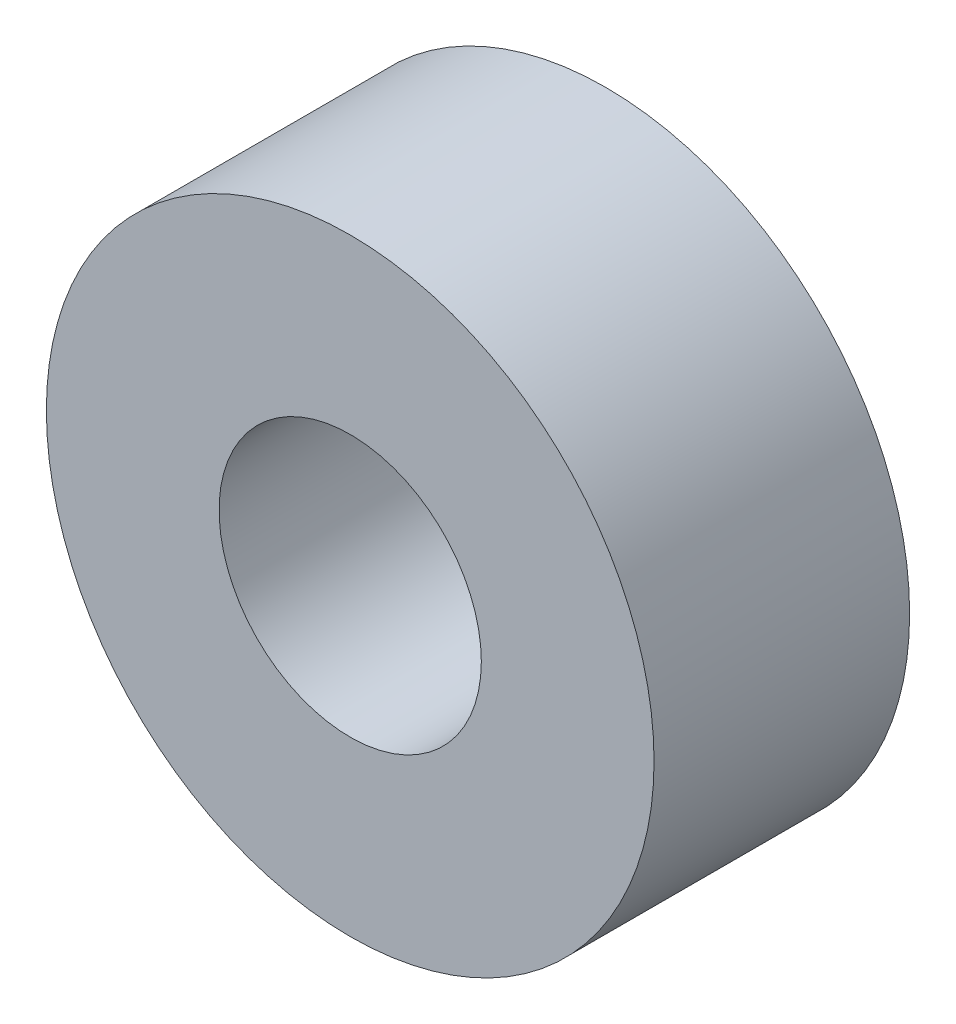
ISO-10303-21;
HEADER;
FILE_DESCRIPTION(('STEP AP214'),'2;1');
FILE_NAME('part.step','',(''),(''),'','','');
FILE_SCHEMA(('AUTOMOTIVE_DESIGN { 1 0 10303 214 1 1 1 1 }'));
ENDSEC;
DATA;
#1=APPLICATION_CONTEXT('core data for automotive mechanical design processes');
#2=APPLICATION_PROTOCOL_DEFINITION('international standard','automotive_design',2000,#1);
#3=PRODUCT_CONTEXT('',#1,'mechanical');
#4=PRODUCT('Part','Part','',(#3));
#5=PRODUCT_RELATED_PRODUCT_CATEGORY('part','',(#4));
#6=PRODUCT_DEFINITION_FORMATION('','',#4);
#7=PRODUCT_DEFINITION_CONTEXT('part definition',#1,'design');
#8=PRODUCT_DEFINITION('design','',#6,#7);
#9=PRODUCT_DEFINITION_SHAPE('','',#8);
#10=(LENGTH_UNIT() NAMED_UNIT(*) SI_UNIT(.MILLI.,.METRE.));
#11=(NAMED_UNIT(*) PLANE_ANGLE_UNIT() SI_UNIT($,.RADIAN.));
#12=(NAMED_UNIT(*) SI_UNIT($,.STERADIAN.) SOLID_ANGLE_UNIT());
#13=UNCERTAINTY_MEASURE_WITH_UNIT(LENGTH_MEASURE(1.E-05),#10,'distance_accuracy_value','');
#14=(GEOMETRIC_REPRESENTATION_CONTEXT(3) GLOBAL_UNCERTAINTY_ASSIGNED_CONTEXT((#13)) GLOBAL_UNIT_ASSIGNED_CONTEXT((#10,
#11,#12)) REPRESENTATION_CONTEXT('',''));
#15=CARTESIAN_POINT('',(0.,0.,0.));
#16=DIRECTION('',(0.,0.,1.));
#17=DIRECTION('',(1.,0.,0.));
#18=AXIS2_PLACEMENT_3D('',#15,#16,#17);
#19=CARTESIAN_POINT('',(0.,0.,35.));
#20=DIRECTION('',(0.,0.,-1.));
#21=DIRECTION('',(-1.,0.,0.));
#22=AXIS2_PLACEMENT_3D('',#19,#20,#21);
#23=CYLINDRICAL_SURFACE('',#22,41.61);
#24=CARTESIAN_POINT('',(0.,0.,35.));
#25=DIRECTION('',(0.,0.,1.));
#26=DIRECTION('',(1.,0.,0.));
#27=AXIS2_PLACEMENT_3D('',#24,#25,#26);
#28=CIRCLE('',#27,41.61);
#29=CARTESIAN_POINT('',(41.61,0.,35.));
#30=VERTEX_POINT('',#29);
#31=EDGE_CURVE('E10',#30,#30,#28,.T.);
#32=ORIENTED_EDGE('',*,*,#31,.F.);
#33=EDGE_LOOP('',(#32));
#34=FACE_BOUND('',#33,.T.);
#35=CARTESIAN_POINT('',(0.,0.,0.));
#36=DIRECTION('',(0.,0.,1.));
#37=DIRECTION('',(1.,0.,0.));
#38=AXIS2_PLACEMENT_3D('',#35,#36,#37);
#39=CIRCLE('',#38,41.61);
#40=CARTESIAN_POINT('',(41.61,0.,0.));
#41=VERTEX_POINT('',#40);
#42=EDGE_CURVE('E33',#41,#41,#39,.T.);
#43=ORIENTED_EDGE('',*,*,#42,.T.);
#44=EDGE_LOOP('',(#43));
#45=FACE_BOUND('',#44,.T.);
#46=ADVANCED_FACE('F30',(#34,#45),#23,.T.);
#47=CARTESIAN_POINT('',(0.,0.,35.));
#48=DIRECTION('',(0.,0.,1.));
#49=DIRECTION('',(1.,0.,0.));
#50=AXIS2_PLACEMENT_3D('',#47,#48,#49);
#51=PLANE('',#50);
#52=CARTESIAN_POINT('',(0.,0.,35.));
#53=DIRECTION('',(0.,0.,1.));
#54=DIRECTION('',(1.,0.,0.));
#55=AXIS2_PLACEMENT_3D('',#52,#53,#54);
#56=CIRCLE('',#55,17.9565);
#57=CARTESIAN_POINT('',(17.9565,0.,35.));
#58=VERTEX_POINT('',#57);
#59=EDGE_CURVE('E42',#58,#58,#56,.T.);
#60=ORIENTED_EDGE('',*,*,#59,.F.);
#61=EDGE_LOOP('',(#60));
#62=FACE_BOUND('',#61,.T.);
#63=ORIENTED_EDGE('',*,*,#31,.T.);
#64=EDGE_LOOP('',(#63));
#65=FACE_BOUND('',#64,.T.);
#66=ADVANCED_FACE('F57',(#62,#65),#51,.T.);
#67=CARTESIAN_POINT('',(0.,0.,0.));
#68=DIRECTION('',(0.,0.,1.));
#69=DIRECTION('',(1.,0.,0.));
#70=AXIS2_PLACEMENT_3D('',#67,#68,#69);
#71=PLANE('',#70);
#72=CARTESIAN_POINT('',(0.,0.,0.));
#73=DIRECTION('',(0.,0.,1.));
#74=DIRECTION('',(1.,0.,0.));
#75=AXIS2_PLACEMENT_3D('',#72,#73,#74);
#76=CIRCLE('',#75,17.9565);
#77=CARTESIAN_POINT('',(17.9565,0.,0.));
#78=VERTEX_POINT('',#77);
#79=EDGE_CURVE('E40',#78,#78,#76,.T.);
#80=ORIENTED_EDGE('',*,*,#79,.T.);
#81=EDGE_LOOP('',(#80));
#82=FACE_BOUND('',#81,.T.);
#83=ORIENTED_EDGE('',*,*,#42,.F.);
#84=EDGE_LOOP('',(#83));
#85=FACE_BOUND('',#84,.T.);
#86=ADVANCED_FACE('F48',(#82,#85),#71,.F.);
#87=CARTESIAN_POINT('',(0.,0.,0.));
#88=DIRECTION('',(0.,0.,1.));
#89=DIRECTION('',(1.,0.,0.));
#90=AXIS2_PLACEMENT_3D('',#87,#88,#89);
#91=CYLINDRICAL_SURFACE('',#90,17.9565);
#92=ORIENTED_EDGE('',*,*,#79,.F.);
#93=EDGE_LOOP('',(#92));
#94=FACE_BOUND('',#93,.T.);
#95=ORIENTED_EDGE('',*,*,#59,.T.);
#96=EDGE_LOOP('',(#95));
#97=FACE_BOUND('',#96,.T.);
#98=ADVANCED_FACE('F51',(#94,#97),#91,.F.);
#99=CLOSED_SHELL('',(#46,#66,#86,#98));
#100=MANIFOLD_SOLID_BREP('B2',#99);
#101=ADVANCED_BREP_SHAPE_REPRESENTATION('',(#18,#100),#14);
#102=SHAPE_DEFINITION_REPRESENTATION(#9,#101);
ENDSEC;
END-ISO-10303-21;
